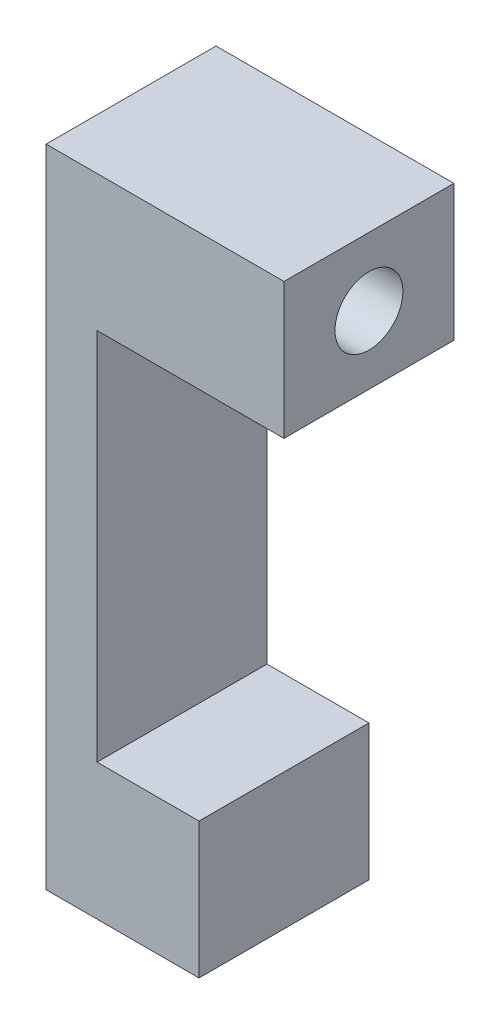
ISO-10303-21;
HEADER;
FILE_DESCRIPTION(('STEP AP214'),'2;1');
FILE_NAME('part.step','',(''),(''),'','','');
FILE_SCHEMA(('AUTOMOTIVE_DESIGN { 1 0 10303 214 1 1 1 1 }'));
ENDSEC;
DATA;
#1=APPLICATION_CONTEXT('core data for automotive mechanical design processes');
#2=APPLICATION_PROTOCOL_DEFINITION('international standard','automotive_design',2000,#1);
#3=PRODUCT_CONTEXT('',#1,'mechanical');
#4=PRODUCT('Part','Part','',(#3));
#5=PRODUCT_RELATED_PRODUCT_CATEGORY('part','',(#4));
#6=PRODUCT_DEFINITION_FORMATION('','',#4);
#7=PRODUCT_DEFINITION_CONTEXT('part definition',#1,'design');
#8=PRODUCT_DEFINITION('design','',#6,#7);
#9=PRODUCT_DEFINITION_SHAPE('','',#8);
#10=(LENGTH_UNIT() NAMED_UNIT(*) SI_UNIT(.MILLI.,.METRE.));
#11=(NAMED_UNIT(*) PLANE_ANGLE_UNIT() SI_UNIT($,.RADIAN.));
#12=(NAMED_UNIT(*) SI_UNIT($,.STERADIAN.) SOLID_ANGLE_UNIT());
#13=UNCERTAINTY_MEASURE_WITH_UNIT(LENGTH_MEASURE(1.E-05),#10,'distance_accuracy_value','');
#14=(GEOMETRIC_REPRESENTATION_CONTEXT(3) GLOBAL_UNCERTAINTY_ASSIGNED_CONTEXT((#13)) GLOBAL_UNIT_ASSIGNED_CONTEXT((#10,
#11,#12)) REPRESENTATION_CONTEXT('',''));
#15=CARTESIAN_POINT('',(0.,0.,0.));
#16=DIRECTION('',(0.,0.,1.));
#17=DIRECTION('',(1.,0.,0.));
#18=AXIS2_PLACEMENT_3D('',#15,#16,#17);
#19=CARTESIAN_POINT('',(55.,55.,0.));
#20=DIRECTION('',(0.,1.,0.));
#21=DIRECTION('',(0.,0.,1.));
#22=AXIS2_PLACEMENT_3D('',#19,#20,#21);
#23=PLANE('',#22);
#24=DIRECTION('',(0.,0.,-1.));
#25=VECTOR('',#24,1.);
#26=CARTESIAN_POINT('',(0.,55.,0.));
#27=LINE('',#26,#25);
#28=CARTESIAN_POINT('',(0.,55.,25.));
#29=VERTEX_POINT('',#28);
#30=CARTESIAN_POINT('',(0.,55.,-25.));
#31=VERTEX_POINT('',#30);
#32=EDGE_CURVE('E160',#29,#31,#27,.T.);
#33=ORIENTED_EDGE('',*,*,#32,.T.);
#34=DIRECTION('',(-1.,0.,0.));
#35=VECTOR('',#34,1.);
#36=CARTESIAN_POINT('',(55.,55.,-25.));
#37=LINE('',#36,#35);
#38=CARTESIAN_POINT('',(55.,55.,-25.));
#39=VERTEX_POINT('',#38);
#40=EDGE_CURVE('E11',#39,#31,#37,.T.);
#41=ORIENTED_EDGE('',*,*,#40,.F.);
#42=DIRECTION('',(0.,0.,-1.));
#43=VECTOR('',#42,1.);
#44=CARTESIAN_POINT('',(55.,55.,0.));
#45=LINE('',#44,#43);
#46=CARTESIAN_POINT('',(55.,55.,25.));
#47=VERTEX_POINT('',#46);
#48=EDGE_CURVE('E190',#47,#39,#45,.T.);
#49=ORIENTED_EDGE('',*,*,#48,.F.);
#50=DIRECTION('',(-1.,0.,0.));
#51=VECTOR('',#50,1.);
#52=CARTESIAN_POINT('',(55.,55.,25.));
#53=LINE('',#52,#51);
#54=EDGE_CURVE('E155',#47,#29,#53,.T.);
#55=ORIENTED_EDGE('',*,*,#54,.T.);
#56=EDGE_LOOP('',(#33,#41,#49,#55));
#57=FACE_BOUND('',#56,.T.);
#58=ADVANCED_FACE('F39',(#57),#23,.F.);
#59=CARTESIAN_POINT('',(55.,0.,-25.));
#60=DIRECTION('',(0.,0.,1.));
#61=DIRECTION('',(1.,0.,0.));
#62=AXIS2_PLACEMENT_3D('',#59,#60,#61);
#63=PLANE('',#62);
#64=ORIENTED_EDGE('',*,*,#40,.T.);
#65=DIRECTION('',(0.,1.,0.));
#66=VECTOR('',#65,1.);
#67=CARTESIAN_POINT('',(0.,0.,-25.));
#68=LINE('',#67,#66);
#69=CARTESIAN_POINT('',(0.,-55.,-25.));
#70=VERTEX_POINT('',#69);
#71=EDGE_CURVE('E43',#70,#31,#68,.T.);
#72=ORIENTED_EDGE('',*,*,#71,.F.);
#73=DIRECTION('',(-1.,0.,0.));
#74=VECTOR('',#73,1.);
#75=CARTESIAN_POINT('',(30.,-55.,-25.));
#76=LINE('',#75,#74);
#77=CARTESIAN_POINT('',(30.,-55.,-25.));
#78=VERTEX_POINT('',#77);
#79=EDGE_CURVE('E112',#78,#70,#76,.T.);
#80=ORIENTED_EDGE('',*,*,#79,.F.);
#81=DIRECTION('',(0.,1.,0.));
#82=VECTOR('',#81,1.);
#83=CARTESIAN_POINT('',(30.,0.,-25.));
#84=LINE('',#83,#82);
#85=CARTESIAN_POINT('',(30.,-95.,-25.));
#86=VERTEX_POINT('',#85);
#87=EDGE_CURVE('E120',#86,#78,#84,.T.);
#88=ORIENTED_EDGE('',*,*,#87,.F.);
#89=DIRECTION('',(1.,0.,0.));
#90=VECTOR('',#89,1.);
#91=CARTESIAN_POINT('',(-15.,-95.,-25.));
#92=LINE('',#91,#90);
#93=CARTESIAN_POINT('',(-15.,-95.,-25.));
#94=VERTEX_POINT('',#93);
#95=EDGE_CURVE('E165',#94,#86,#92,.T.);
#96=ORIENTED_EDGE('',*,*,#95,.F.);
#97=DIRECTION('',(0.,1.,0.));
#98=VECTOR('',#97,1.);
#99=CARTESIAN_POINT('',(-15.,0.,-25.));
#100=LINE('',#99,#98);
#101=CARTESIAN_POINT('',(-15.,95.,-25.));
#102=VERTEX_POINT('',#101);
#103=EDGE_CURVE('E143',#94,#102,#100,.T.);
#104=ORIENTED_EDGE('',*,*,#103,.T.);
#105=DIRECTION('',(-1.,0.,0.));
#106=VECTOR('',#105,1.);
#107=CARTESIAN_POINT('',(55.,95.,-25.));
#108=LINE('',#107,#106);
#109=CARTESIAN_POINT('',(55.,95.,-25.));
#110=VERTEX_POINT('',#109);
#111=EDGE_CURVE('E49',#110,#102,#108,.T.);
#112=ORIENTED_EDGE('',*,*,#111,.F.);
#113=DIRECTION('',(0.,1.,0.));
#114=VECTOR('',#113,1.);
#115=CARTESIAN_POINT('',(55.,0.,-25.));
#116=LINE('',#115,#114);
#117=EDGE_CURVE('E193',#39,#110,#116,.T.);
#118=ORIENTED_EDGE('',*,*,#117,.F.);
#119=EDGE_LOOP('',(#64,#72,#80,#88,#96,#104,#112,#118));
#120=FACE_BOUND('',#119,.T.);
#121=ADVANCED_FACE('F184',(#120),#63,.F.);
#122=CARTESIAN_POINT('',(55.,95.,0.));
#123=DIRECTION('',(0.,1.,0.));
#124=DIRECTION('',(0.,0.,1.));
#125=AXIS2_PLACEMENT_3D('',#122,#123,#124);
#126=PLANE('',#125);
#127=ORIENTED_EDGE('',*,*,#111,.T.);
#128=DIRECTION('',(0.,0.,-1.));
#129=VECTOR('',#128,1.);
#130=CARTESIAN_POINT('',(-15.,95.,0.));
#131=LINE('',#130,#129);
#132=CARTESIAN_POINT('',(-15.,95.,25.));
#133=VERTEX_POINT('',#132);
#134=EDGE_CURVE('E146',#133,#102,#131,.T.);
#135=ORIENTED_EDGE('',*,*,#134,.F.);
#136=DIRECTION('',(-1.,0.,0.));
#137=VECTOR('',#136,1.);
#138=CARTESIAN_POINT('',(55.,95.,25.));
#139=LINE('',#138,#137);
#140=CARTESIAN_POINT('',(55.,95.,25.));
#141=VERTEX_POINT('',#140);
#142=EDGE_CURVE('E158',#141,#133,#139,.T.);
#143=ORIENTED_EDGE('',*,*,#142,.F.);
#144=DIRECTION('',(0.,0.,-1.));
#145=VECTOR('',#144,1.);
#146=CARTESIAN_POINT('',(55.,95.,0.));
#147=LINE('',#146,#145);
#148=EDGE_CURVE('E178',#141,#110,#147,.T.);
#149=ORIENTED_EDGE('',*,*,#148,.T.);
#150=EDGE_LOOP('',(#127,#135,#143,#149));
#151=FACE_BOUND('',#150,.T.);
#152=ADVANCED_FACE('F176',(#151),#126,.T.);
#153=CARTESIAN_POINT('',(55.,75.,0.));
#154=DIRECTION('',(-1.,0.,0.));
#155=DIRECTION('',(0.,0.,1.));
#156=AXIS2_PLACEMENT_3D('',#153,#154,#155);
#157=CYLINDRICAL_SURFACE('',#156,10.);
#158=CARTESIAN_POINT('',(55.,75.,0.));
#159=DIRECTION('',(1.,0.,0.));
#160=DIRECTION('',(0.,0.,-1.));
#161=AXIS2_PLACEMENT_3D('',#158,#159,#160);
#162=CIRCLE('',#161,10.);
#163=CARTESIAN_POINT('',(55.,75.,-10.));
#164=VERTEX_POINT('',#163);
#165=EDGE_CURVE('E164',#164,#164,#162,.T.);
#166=ORIENTED_EDGE('',*,*,#165,.T.);
#167=EDGE_LOOP('',(#166));
#168=FACE_BOUND('',#167,.T.);
#169=CARTESIAN_POINT('',(-15.,75.,0.));
#170=DIRECTION('',(1.,0.,0.));
#171=DIRECTION('',(0.,0.,-1.));
#172=AXIS2_PLACEMENT_3D('',#169,#170,#171);
#173=CIRCLE('',#172,10.);
#174=CARTESIAN_POINT('',(-15.,75.,-10.));
#175=VERTEX_POINT('',#174);
#176=EDGE_CURVE('E134',#175,#175,#173,.T.);
#177=ORIENTED_EDGE('',*,*,#176,.F.);
#178=EDGE_LOOP('',(#177));
#179=FACE_BOUND('',#178,.T.);
#180=ADVANCED_FACE('F41',(#168,#179),#157,.F.);
#181=CARTESIAN_POINT('',(55.,0.,25.));
#182=DIRECTION('',(0.,0.,1.));
#183=DIRECTION('',(1.,0.,0.));
#184=AXIS2_PLACEMENT_3D('',#181,#182,#183);
#185=PLANE('',#184);
#186=ORIENTED_EDGE('',*,*,#142,.T.);
#187=DIRECTION('',(0.,1.,0.));
#188=VECTOR('',#187,1.);
#189=CARTESIAN_POINT('',(-15.,0.,25.));
#190=LINE('',#189,#188);
#191=CARTESIAN_POINT('',(-15.,-95.,25.));
#192=VERTEX_POINT('',#191);
#193=EDGE_CURVE('E137',#192,#133,#190,.T.);
#194=ORIENTED_EDGE('',*,*,#193,.F.);
#195=DIRECTION('',(1.,0.,0.));
#196=VECTOR('',#195,1.);
#197=CARTESIAN_POINT('',(-15.,-95.,25.));
#198=LINE('',#197,#196);
#199=CARTESIAN_POINT('',(30.,-95.,25.));
#200=VERTEX_POINT('',#199);
#201=EDGE_CURVE('E125',#192,#200,#198,.T.);
#202=ORIENTED_EDGE('',*,*,#201,.T.);
#203=DIRECTION('',(0.,1.,0.));
#204=VECTOR('',#203,1.);
#205=CARTESIAN_POINT('',(30.,0.,25.));
#206=LINE('',#205,#204);
#207=CARTESIAN_POINT('',(30.,-55.,25.));
#208=VERTEX_POINT('',#207);
#209=EDGE_CURVE('E118',#200,#208,#206,.T.);
#210=ORIENTED_EDGE('',*,*,#209,.T.);
#211=DIRECTION('',(-1.,0.,0.));
#212=VECTOR('',#211,1.);
#213=CARTESIAN_POINT('',(30.,-55.,25.));
#214=LINE('',#213,#212);
#215=CARTESIAN_POINT('',(0.,-55.,25.));
#216=VERTEX_POINT('',#215);
#217=EDGE_CURVE('E105',#208,#216,#214,.T.);
#218=ORIENTED_EDGE('',*,*,#217,.T.);
#219=DIRECTION('',(0.,1.,0.));
#220=VECTOR('',#219,1.);
#221=CARTESIAN_POINT('',(0.,0.,25.));
#222=LINE('',#221,#220);
#223=EDGE_CURVE('E62',#216,#29,#222,.T.);
#224=ORIENTED_EDGE('',*,*,#223,.T.);
#225=ORIENTED_EDGE('',*,*,#54,.F.);
#226=DIRECTION('',(0.,1.,0.));
#227=VECTOR('',#226,1.);
#228=CARTESIAN_POINT('',(55.,0.,25.));
#229=LINE('',#228,#227);
#230=EDGE_CURVE('E159',#47,#141,#229,.T.);
#231=ORIENTED_EDGE('',*,*,#230,.T.);
#232=EDGE_LOOP('',(#186,#194,#202,#210,#218,#224,#225,#231));
#233=FACE_BOUND('',#232,.T.);
#234=ADVANCED_FACE('F123',(#233),#185,.T.);
#235=CARTESIAN_POINT('',(55.,0.,0.));
#236=DIRECTION('',(1.,0.,0.));
#237=DIRECTION('',(0.,0.,-1.));
#238=AXIS2_PLACEMENT_3D('',#235,#236,#237);
#239=PLANE('',#238);
#240=ORIENTED_EDGE('',*,*,#165,.F.);
#241=EDGE_LOOP('',(#240));
#242=FACE_BOUND('',#241,.T.);
#243=ORIENTED_EDGE('',*,*,#48,.T.);
#244=ORIENTED_EDGE('',*,*,#117,.T.);
#245=ORIENTED_EDGE('',*,*,#148,.F.);
#246=ORIENTED_EDGE('',*,*,#230,.F.);
#247=EDGE_LOOP('',(#243,#244,#245,#246));
#248=FACE_BOUND('',#247,.T.);
#249=ADVANCED_FACE('F198',(#242,#248),#239,.T.);
#250=CARTESIAN_POINT('',(0.,0.,0.));
#251=DIRECTION('',(1.,0.,0.));
#252=DIRECTION('',(0.,0.,-1.));
#253=AXIS2_PLACEMENT_3D('',#250,#251,#252);
#254=PLANE('',#253);
#255=DIRECTION('',(0.,0.,-1.));
#256=VECTOR('',#255,1.);
#257=CARTESIAN_POINT('',(0.,-55.,0.));
#258=LINE('',#257,#256);
#259=EDGE_CURVE('E57',#216,#70,#258,.T.);
#260=ORIENTED_EDGE('',*,*,#259,.T.);
#261=ORIENTED_EDGE('',*,*,#71,.T.);
#262=ORIENTED_EDGE('',*,*,#32,.F.);
#263=ORIENTED_EDGE('',*,*,#223,.F.);
#264=EDGE_LOOP('',(#260,#261,#262,#263));
#265=FACE_BOUND('',#264,.T.);
#266=ADVANCED_FACE('F201',(#265),#254,.T.);
#267=CARTESIAN_POINT('',(-15.,-95.,0.));
#268=DIRECTION('',(0.,-1.,0.));
#269=DIRECTION('',(0.,0.,-1.));
#270=AXIS2_PLACEMENT_3D('',#267,#268,#269);
#271=PLANE('',#270);
#272=ORIENTED_EDGE('',*,*,#95,.T.);
#273=DIRECTION('',(0.,0.,-1.));
#274=VECTOR('',#273,1.);
#275=CARTESIAN_POINT('',(30.,-95.,0.));
#276=LINE('',#275,#274);
#277=EDGE_CURVE('E127',#200,#86,#276,.T.);
#278=ORIENTED_EDGE('',*,*,#277,.F.);
#279=ORIENTED_EDGE('',*,*,#201,.F.);
#280=DIRECTION('',(0.,0.,-1.));
#281=VECTOR('',#280,1.);
#282=CARTESIAN_POINT('',(-15.,-95.,0.));
#283=LINE('',#282,#281);
#284=EDGE_CURVE('E140',#192,#94,#283,.T.);
#285=ORIENTED_EDGE('',*,*,#284,.T.);
#286=EDGE_LOOP('',(#272,#278,#279,#285));
#287=FACE_BOUND('',#286,.T.);
#288=ADVANCED_FACE('F203',(#287),#271,.T.);
#289=CARTESIAN_POINT('',(-15.,0.,0.));
#290=DIRECTION('',(1.,0.,0.));
#291=DIRECTION('',(0.,0.,-1.));
#292=AXIS2_PLACEMENT_3D('',#289,#290,#291);
#293=PLANE('',#292);
#294=ORIENTED_EDGE('',*,*,#176,.T.);
#295=EDGE_LOOP('',(#294));
#296=FACE_BOUND('',#295,.T.);
#297=ORIENTED_EDGE('',*,*,#193,.T.);
#298=ORIENTED_EDGE('',*,*,#134,.T.);
#299=ORIENTED_EDGE('',*,*,#103,.F.);
#300=ORIENTED_EDGE('',*,*,#284,.F.);
#301=EDGE_LOOP('',(#297,#298,#299,#300));
#302=FACE_BOUND('',#301,.T.);
#303=ADVANCED_FACE('F182',(#296,#302),#293,.F.);
#304=CARTESIAN_POINT('',(30.,-55.,0.));
#305=DIRECTION('',(0.,1.,0.));
#306=DIRECTION('',(0.,0.,1.));
#307=AXIS2_PLACEMENT_3D('',#304,#305,#306);
#308=PLANE('',#307);
#309=ORIENTED_EDGE('',*,*,#259,.F.);
#310=ORIENTED_EDGE('',*,*,#217,.F.);
#311=DIRECTION('',(0.,0.,-1.));
#312=VECTOR('',#311,1.);
#313=CARTESIAN_POINT('',(30.,-55.,0.));
#314=LINE('',#313,#312);
#315=EDGE_CURVE('E109',#208,#78,#314,.T.);
#316=ORIENTED_EDGE('',*,*,#315,.T.);
#317=ORIENTED_EDGE('',*,*,#79,.T.);
#318=EDGE_LOOP('',(#309,#310,#316,#317));
#319=FACE_BOUND('',#318,.T.);
#320=ADVANCED_FACE('F107',(#319),#308,.T.);
#321=CARTESIAN_POINT('',(30.,0.,0.));
#322=DIRECTION('',(1.,0.,0.));
#323=DIRECTION('',(0.,0.,-1.));
#324=AXIS2_PLACEMENT_3D('',#321,#322,#323);
#325=PLANE('',#324);
#326=ORIENTED_EDGE('',*,*,#315,.F.);
#327=ORIENTED_EDGE('',*,*,#209,.F.);
#328=ORIENTED_EDGE('',*,*,#277,.T.);
#329=ORIENTED_EDGE('',*,*,#87,.T.);
#330=EDGE_LOOP('',(#326,#327,#328,#329));
#331=FACE_BOUND('',#330,.T.);
#332=ADVANCED_FACE('F116',(#331),#325,.T.);
#333=CLOSED_SHELL('',(#58,#121,#152,#180,#234,#249,#266,#288,#303,#320,#332));
#334=MANIFOLD_SOLID_BREP('B2',#333);
#335=ADVANCED_BREP_SHAPE_REPRESENTATION('',(#18,#334),#14);
#336=SHAPE_DEFINITION_REPRESENTATION(#9,#335);
ENDSEC;
END-ISO-10303-21;
